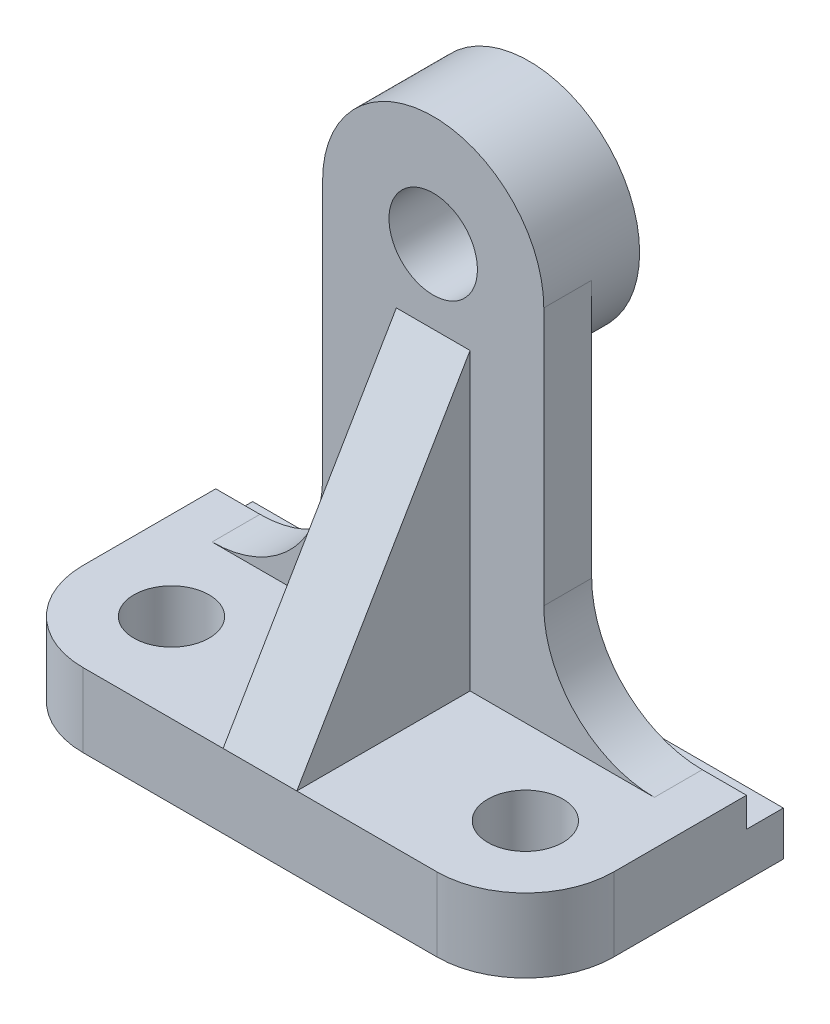
ISO-10303-21;
HEADER;
FILE_DESCRIPTION(('STEP AP214'),'2;1');
FILE_NAME('part.step','',(''),(''),'','','');
FILE_SCHEMA(('AUTOMOTIVE_DESIGN { 1 0 10303 214 1 1 1 1 }'));
ENDSEC;
DATA;
#1=APPLICATION_CONTEXT('core data for automotive mechanical design processes');
#2=APPLICATION_PROTOCOL_DEFINITION('international standard','automotive_design',2000,#1);
#3=PRODUCT_CONTEXT('',#1,'mechanical');
#4=PRODUCT('Part','Part','',(#3));
#5=PRODUCT_RELATED_PRODUCT_CATEGORY('part','',(#4));
#6=PRODUCT_DEFINITION_FORMATION('','',#4);
#7=PRODUCT_DEFINITION_CONTEXT('part definition',#1,'design');
#8=PRODUCT_DEFINITION('design','',#6,#7);
#9=PRODUCT_DEFINITION_SHAPE('','',#8);
#10=(LENGTH_UNIT() NAMED_UNIT(*) SI_UNIT(.MILLI.,.METRE.));
#11=(NAMED_UNIT(*) PLANE_ANGLE_UNIT() SI_UNIT($,.RADIAN.));
#12=(NAMED_UNIT(*) SI_UNIT($,.STERADIAN.) SOLID_ANGLE_UNIT());
#13=UNCERTAINTY_MEASURE_WITH_UNIT(LENGTH_MEASURE(1.E-05),#10,'distance_accuracy_value','');
#14=(GEOMETRIC_REPRESENTATION_CONTEXT(3) GLOBAL_UNCERTAINTY_ASSIGNED_CONTEXT((#13)) GLOBAL_UNIT_ASSIGNED_CONTEXT((#10,
#11,#12)) REPRESENTATION_CONTEXT('',''));
#15=CARTESIAN_POINT('',(0.,0.,0.));
#16=DIRECTION('',(0.,0.,1.));
#17=DIRECTION('',(1.,0.,0.));
#18=AXIS2_PLACEMENT_3D('',#15,#16,#17);
#19=CARTESIAN_POINT('',(0.,10.,0.));
#20=DIRECTION('',(0.,-1.,0.));
#21=DIRECTION('',(0.,0.,-1.));
#22=AXIS2_PLACEMENT_3D('',#19,#20,#21);
#23=PLANE('',#22);
#24=CARTESIAN_POINT('',(24.,10.,5.5));
#25=DIRECTION('',(0.,1.,0.));
#26=DIRECTION('',(0.,0.,1.));
#27=AXIS2_PLACEMENT_3D('',#24,#25,#26);
#28=CIRCLE('',#27,5.1);
#29=CARTESIAN_POINT('',(24.,10.,10.6));
#30=VERTEX_POINT('',#29);
#31=EDGE_CURVE('E237',#30,#30,#28,.T.);
#32=ORIENTED_EDGE('',*,*,#31,.F.);
#33=EDGE_LOOP('',(#32));
#34=FACE_BOUND('',#33,.T.);
#35=DIRECTION('',(0.,0.,-1.));
#36=VECTOR('',#35,1.);
#37=CARTESIAN_POINT('',(5.,10.,17.5));
#38=LINE('',#37,#36);
#39=CARTESIAN_POINT('',(5.,10.,17.5));
#40=VERTEX_POINT('',#39);
#41=CARTESIAN_POINT('',(5.,10.,-6.));
#42=VERTEX_POINT('',#41);
#43=EDGE_CURVE('E171',#40,#42,#38,.T.);
#44=ORIENTED_EDGE('',*,*,#43,.F.);
#45=DIRECTION('',(1.,0.,0.));
#46=VECTOR('',#45,1.);
#47=CARTESIAN_POINT('',(-36.,10.,17.5));
#48=LINE('',#47,#46);
#49=CARTESIAN_POINT('',(24.,10.,17.5));
#50=VERTEX_POINT('',#49);
#51=EDGE_CURVE('E250',#40,#50,#48,.T.);
#52=ORIENTED_EDGE('',*,*,#51,.T.);
#53=CARTESIAN_POINT('',(24.,10.,5.5));
#54=DIRECTION('',(0.,-1.,0.));
#55=DIRECTION('',(0.,0.,-1.));
#56=AXIS2_PLACEMENT_3D('',#53,#54,#55);
#57=CIRCLE('',#56,12.);
#58=CARTESIAN_POINT('',(36.,10.,5.5));
#59=VERTEX_POINT('',#58);
#60=EDGE_CURVE('E276',#50,#59,#57,.F.);
#61=ORIENTED_EDGE('',*,*,#60,.T.);
#62=DIRECTION('',(0.,0.,-1.));
#63=VECTOR('',#62,1.);
#64=CARTESIAN_POINT('',(36.,10.,17.5));
#65=LINE('',#64,#63);
#66=CARTESIAN_POINT('',(36.,10.,-12.5));
#67=VERTEX_POINT('',#66);
#68=EDGE_CURVE('E242',#59,#67,#65,.T.);
#69=ORIENTED_EDGE('',*,*,#68,.T.);
#70=DIRECTION('',(-1.,0.,0.));
#71=VECTOR('',#70,1.);
#72=CARTESIAN_POINT('',(39.,10.,-12.5));
#73=LINE('',#72,#71);
#74=CARTESIAN_POINT('',(30.,10.,-12.5));
#75=VERTEX_POINT('',#74);
#76=EDGE_CURVE('E225',#67,#75,#73,.T.);
#77=ORIENTED_EDGE('',*,*,#76,.T.);
#78=DIRECTION('',(0.,0.,-1.));
#79=VECTOR('',#78,1.);
#80=CARTESIAN_POINT('',(30.,10.,-6.));
#81=LINE('',#80,#79);
#82=CARTESIAN_POINT('',(30.,10.,-6.));
#83=VERTEX_POINT('',#82);
#84=EDGE_CURVE('E295',#75,#83,#81,.F.);
#85=ORIENTED_EDGE('',*,*,#84,.T.);
#86=DIRECTION('',(1.,0.,0.));
#87=VECTOR('',#86,1.);
#88=CARTESIAN_POINT('',(0.,10.,-6.));
#89=LINE('',#88,#87);
#90=EDGE_CURVE('E200',#42,#83,#89,.T.);
#91=ORIENTED_EDGE('',*,*,#90,.F.);
#92=EDGE_LOOP('',(#44,#52,#61,#69,#77,#85,#91));
#93=FACE_BOUND('',#92,.T.);
#94=ADVANCED_FACE('F41',(#34,#93),#23,.F.);
#95=CARTESIAN_POINT('',(-24.,10.,5.5));
#96=DIRECTION('',(0.,1.,0.));
#97=DIRECTION('',(0.,0.,-1.));
#98=AXIS2_PLACEMENT_3D('',#95,#96,#97);
#99=CIRCLE('',#98,5.1);
#100=CARTESIAN_POINT('',(-24.,10.,0.4));
#101=VERTEX_POINT('',#100);
#102=EDGE_CURVE('E230',#101,#101,#99,.T.);
#103=ORIENTED_EDGE('',*,*,#102,.F.);
#104=EDGE_LOOP('',(#103));
#105=FACE_BOUND('',#104,.T.);
#106=CARTESIAN_POINT('',(-24.,10.,17.5));
#107=VERTEX_POINT('',#106);
#108=CARTESIAN_POINT('',(-5.,10.,17.5));
#109=VERTEX_POINT('',#108);
#110=EDGE_CURVE('E248',#107,#109,#48,.T.);
#111=ORIENTED_EDGE('',*,*,#110,.T.);
#112=DIRECTION('',(0.,0.,-1.));
#113=VECTOR('',#112,1.);
#114=CARTESIAN_POINT('',(-5.,10.,17.5));
#115=LINE('',#114,#113);
#116=CARTESIAN_POINT('',(-5.,10.,-6.));
#117=VERTEX_POINT('',#116);
#118=EDGE_CURVE('E179',#109,#117,#115,.T.);
#119=ORIENTED_EDGE('',*,*,#118,.T.);
#120=CARTESIAN_POINT('',(-30.,10.,-6.));
#121=VERTEX_POINT('',#120);
#122=EDGE_CURVE('E198',#121,#117,#89,.T.);
#123=ORIENTED_EDGE('',*,*,#122,.F.);
#124=DIRECTION('',(0.,0.,-1.));
#125=VECTOR('',#124,1.);
#126=CARTESIAN_POINT('',(-30.,10.,0.));
#127=LINE('',#126,#125);
#128=CARTESIAN_POINT('',(-30.,10.,-12.5));
#129=VERTEX_POINT('',#128);
#130=EDGE_CURVE('E293',#121,#129,#127,.T.);
#131=ORIENTED_EDGE('',*,*,#130,.T.);
#132=CARTESIAN_POINT('',(-36.,10.,-12.5));
#133=VERTEX_POINT('',#132);
#134=EDGE_CURVE('E226',#129,#133,#73,.T.);
#135=ORIENTED_EDGE('',*,*,#134,.T.);
#136=DIRECTION('',(0.,0.,1.));
#137=VECTOR('',#136,1.);
#138=CARTESIAN_POINT('',(-36.,10.,17.5));
#139=LINE('',#138,#137);
#140=CARTESIAN_POINT('',(-36.,10.,5.5));
#141=VERTEX_POINT('',#140);
#142=EDGE_CURVE('E245',#133,#141,#139,.T.);
#143=ORIENTED_EDGE('',*,*,#142,.T.);
#144=CARTESIAN_POINT('',(-24.,10.,5.5));
#145=DIRECTION('',(0.,-1.,0.));
#146=DIRECTION('',(0.,0.,-1.));
#147=AXIS2_PLACEMENT_3D('',#144,#145,#146);
#148=CIRCLE('',#147,12.);
#149=EDGE_CURVE('E281',#141,#107,#148,.F.);
#150=ORIENTED_EDGE('',*,*,#149,.T.);
#151=EDGE_LOOP('',(#111,#119,#123,#131,#135,#143,#150));
#152=FACE_BOUND('',#151,.T.);
#153=ADVANCED_FACE('F336',(#105,#152),#23,.F.);
#154=CARTESIAN_POINT('',(-36.,10.,-17.5));
#155=DIRECTION('',(0.,0.,1.));
#156=DIRECTION('',(1.,0.,0.));
#157=AXIS2_PLACEMENT_3D('',#154,#155,#156);
#158=PLANE('',#157);
#159=DIRECTION('',(-1.,0.,0.));
#160=VECTOR('',#159,1.);
#161=CARTESIAN_POINT('',(39.,6.,-17.5));
#162=LINE('',#161,#160);
#163=CARTESIAN_POINT('',(36.,6.,-17.5));
#164=VERTEX_POINT('',#163);
#165=CARTESIAN_POINT('',(-36.,6.,-17.5));
#166=VERTEX_POINT('',#165);
#167=EDGE_CURVE('E222',#164,#166,#162,.T.);
#168=ORIENTED_EDGE('',*,*,#167,.F.);
#169=DIRECTION('',(0.,-1.,0.));
#170=VECTOR('',#169,1.);
#171=CARTESIAN_POINT('',(36.,10.,-17.5));
#172=LINE('',#171,#170);
#173=CARTESIAN_POINT('',(36.,0.,-17.5));
#174=VERTEX_POINT('',#173);
#175=EDGE_CURVE('E262',#164,#174,#172,.T.);
#176=ORIENTED_EDGE('',*,*,#175,.T.);
#177=DIRECTION('',(-1.,0.,0.));
#178=VECTOR('',#177,1.);
#179=CARTESIAN_POINT('',(-36.,0.,-17.5));
#180=LINE('',#179,#178);
#181=CARTESIAN_POINT('',(-36.,0.,-17.5));
#182=VERTEX_POINT('',#181);
#183=EDGE_CURVE('E254',#174,#182,#180,.T.);
#184=ORIENTED_EDGE('',*,*,#183,.T.);
#185=DIRECTION('',(0.,-1.,0.));
#186=VECTOR('',#185,1.);
#187=CARTESIAN_POINT('',(-36.,10.,-17.5));
#188=LINE('',#187,#186);
#189=EDGE_CURVE('E252',#166,#182,#188,.T.);
#190=ORIENTED_EDGE('',*,*,#189,.F.);
#191=EDGE_LOOP('',(#168,#176,#184,#190));
#192=FACE_BOUND('',#191,.T.);
#193=ADVANCED_FACE('F362',(#192),#158,.F.);
#194=CARTESIAN_POINT('',(-36.,10.,17.5));
#195=DIRECTION('',(1.,0.,0.));
#196=DIRECTION('',(0.,0.,-1.));
#197=AXIS2_PLACEMENT_3D('',#194,#195,#196);
#198=PLANE('',#197);
#199=DIRECTION('',(0.,0.,1.));
#200=VECTOR('',#199,1.);
#201=CARTESIAN_POINT('',(-36.,6.,-12.5));
#202=LINE('',#201,#200);
#203=CARTESIAN_POINT('',(-36.,6.,-12.5));
#204=VERTEX_POINT('',#203);
#205=EDGE_CURVE('E213',#166,#204,#202,.T.);
#206=ORIENTED_EDGE('',*,*,#205,.F.);
#207=ORIENTED_EDGE('',*,*,#189,.T.);
#208=DIRECTION('',(0.,0.,1.));
#209=VECTOR('',#208,1.);
#210=CARTESIAN_POINT('',(-36.,0.,17.5));
#211=LINE('',#210,#209);
#212=CARTESIAN_POINT('',(-36.,0.,5.5));
#213=VERTEX_POINT('',#212);
#214=EDGE_CURVE('E256',#182,#213,#211,.T.);
#215=ORIENTED_EDGE('',*,*,#214,.T.);
#216=DIRECTION('',(0.,-1.,0.));
#217=VECTOR('',#216,1.);
#218=CARTESIAN_POINT('',(-36.,10.,5.5));
#219=LINE('',#218,#217);
#220=EDGE_CURVE('E277',#213,#141,#219,.F.);
#221=ORIENTED_EDGE('',*,*,#220,.T.);
#222=ORIENTED_EDGE('',*,*,#142,.F.);
#223=DIRECTION('',(0.,1.,0.));
#224=VECTOR('',#223,1.);
#225=CARTESIAN_POINT('',(-36.,10.,-12.5));
#226=LINE('',#225,#224);
#227=EDGE_CURVE('E217',#204,#133,#226,.T.);
#228=ORIENTED_EDGE('',*,*,#227,.F.);
#229=EDGE_LOOP('',(#206,#207,#215,#221,#222,#228));
#230=FACE_BOUND('',#229,.T.);
#231=ADVANCED_FACE('F341',(#230),#198,.F.);
#232=CARTESIAN_POINT('',(0.,0.,0.));
#233=DIRECTION('',(0.,-1.,0.));
#234=DIRECTION('',(0.,0.,-1.));
#235=AXIS2_PLACEMENT_3D('',#232,#233,#234);
#236=PLANE('',#235);
#237=CARTESIAN_POINT('',(24.,0.,5.5));
#238=DIRECTION('',(0.,1.,0.));
#239=DIRECTION('',(0.,0.,1.));
#240=AXIS2_PLACEMENT_3D('',#237,#238,#239);
#241=CIRCLE('',#240,5.1);
#242=CARTESIAN_POINT('',(24.,0.,10.6));
#243=VERTEX_POINT('',#242);
#244=EDGE_CURVE('E235',#243,#243,#241,.T.);
#245=ORIENTED_EDGE('',*,*,#244,.T.);
#246=EDGE_LOOP('',(#245));
#247=FACE_BOUND('',#246,.T.);
#248=DIRECTION('',(1.,0.,0.));
#249=VECTOR('',#248,1.);
#250=CARTESIAN_POINT('',(-36.,0.,17.5));
#251=LINE('',#250,#249);
#252=CARTESIAN_POINT('',(-24.,0.,17.5));
#253=VERTEX_POINT('',#252);
#254=CARTESIAN_POINT('',(24.,0.,17.5));
#255=VERTEX_POINT('',#254);
#256=EDGE_CURVE('E249',#253,#255,#251,.T.);
#257=ORIENTED_EDGE('',*,*,#256,.F.);
#258=CARTESIAN_POINT('',(-24.,0.,5.5));
#259=DIRECTION('',(0.,-1.,0.));
#260=DIRECTION('',(0.,0.,-1.));
#261=AXIS2_PLACEMENT_3D('',#258,#259,#260);
#262=CIRCLE('',#261,12.);
#263=EDGE_CURVE('E273',#253,#213,#262,.T.);
#264=ORIENTED_EDGE('',*,*,#263,.T.);
#265=ORIENTED_EDGE('',*,*,#214,.F.);
#266=ORIENTED_EDGE('',*,*,#183,.F.);
#267=DIRECTION('',(0.,0.,-1.));
#268=VECTOR('',#267,1.);
#269=CARTESIAN_POINT('',(36.,0.,17.5));
#270=LINE('',#269,#268);
#271=CARTESIAN_POINT('',(36.,0.,5.5));
#272=VERTEX_POINT('',#271);
#273=EDGE_CURVE('E239',#272,#174,#270,.T.);
#274=ORIENTED_EDGE('',*,*,#273,.F.);
#275=CARTESIAN_POINT('',(24.,0.,5.5));
#276=DIRECTION('',(0.,-1.,0.));
#277=DIRECTION('',(0.,0.,-1.));
#278=AXIS2_PLACEMENT_3D('',#275,#276,#277);
#279=CIRCLE('',#278,12.);
#280=EDGE_CURVE('E275',#272,#255,#279,.T.);
#281=ORIENTED_EDGE('',*,*,#280,.T.);
#282=EDGE_LOOP('',(#257,#264,#265,#266,#274,#281));
#283=FACE_BOUND('',#282,.T.);
#284=CARTESIAN_POINT('',(-24.,0.,5.5));
#285=DIRECTION('',(0.,1.,0.));
#286=DIRECTION('',(0.,0.,-1.));
#287=AXIS2_PLACEMENT_3D('',#284,#285,#286);
#288=CIRCLE('',#287,5.1);
#289=CARTESIAN_POINT('',(-24.,0.,0.4));
#290=VERTEX_POINT('',#289);
#291=EDGE_CURVE('E223',#290,#290,#288,.T.);
#292=ORIENTED_EDGE('',*,*,#291,.T.);
#293=EDGE_LOOP('',(#292));
#294=FACE_BOUND('',#293,.T.);
#295=ADVANCED_FACE('F359',(#247,#283,#294),#236,.T.);
#296=CARTESIAN_POINT('',(36.,10.,17.5));
#297=DIRECTION('',(-1.,0.,0.));
#298=DIRECTION('',(0.,0.,1.));
#299=AXIS2_PLACEMENT_3D('',#296,#297,#298);
#300=PLANE('',#299);
#301=DIRECTION('',(0.,0.,1.));
#302=VECTOR('',#301,1.);
#303=CARTESIAN_POINT('',(36.,6.,17.5));
#304=LINE('',#303,#302);
#305=CARTESIAN_POINT('',(36.,6.,-12.5));
#306=VERTEX_POINT('',#305);
#307=EDGE_CURVE('E289',#164,#306,#304,.T.);
#308=ORIENTED_EDGE('',*,*,#307,.T.);
#309=DIRECTION('',(0.,1.,0.));
#310=VECTOR('',#309,1.);
#311=CARTESIAN_POINT('',(36.,10.,-12.5));
#312=LINE('',#311,#310);
#313=EDGE_CURVE('E288',#306,#67,#312,.T.);
#314=ORIENTED_EDGE('',*,*,#313,.T.);
#315=ORIENTED_EDGE('',*,*,#68,.F.);
#316=DIRECTION('',(0.,-1.,0.));
#317=VECTOR('',#316,1.);
#318=CARTESIAN_POINT('',(36.,10.,5.5));
#319=LINE('',#318,#317);
#320=EDGE_CURVE('E284',#59,#272,#319,.T.);
#321=ORIENTED_EDGE('',*,*,#320,.T.);
#322=ORIENTED_EDGE('',*,*,#273,.T.);
#323=ORIENTED_EDGE('',*,*,#175,.F.);
#324=EDGE_LOOP('',(#308,#314,#315,#321,#322,#323));
#325=FACE_BOUND('',#324,.T.);
#326=ADVANCED_FACE('F368',(#325),#300,.F.);
#327=CARTESIAN_POINT('',(-36.,10.,17.5));
#328=DIRECTION('',(0.,0.,-1.));
#329=DIRECTION('',(-1.,0.,0.));
#330=AXIS2_PLACEMENT_3D('',#327,#328,#329);
#331=PLANE('',#330);
#332=ORIENTED_EDGE('',*,*,#110,.F.);
#333=DIRECTION('',(0.,-1.,0.));
#334=VECTOR('',#333,1.);
#335=CARTESIAN_POINT('',(-24.,10.,17.5));
#336=LINE('',#335,#334);
#337=EDGE_CURVE('E267',#107,#253,#336,.T.);
#338=ORIENTED_EDGE('',*,*,#337,.T.);
#339=ORIENTED_EDGE('',*,*,#256,.T.);
#340=DIRECTION('',(0.,-1.,0.));
#341=VECTOR('',#340,1.);
#342=CARTESIAN_POINT('',(24.,10.,17.5));
#343=LINE('',#342,#341);
#344=EDGE_CURVE('E266',#255,#50,#343,.F.);
#345=ORIENTED_EDGE('',*,*,#344,.T.);
#346=ORIENTED_EDGE('',*,*,#51,.F.);
#347=DIRECTION('',(-1.,0.,0.));
#348=VECTOR('',#347,1.);
#349=CARTESIAN_POINT('',(5.,10.,17.5));
#350=LINE('',#349,#348);
#351=EDGE_CURVE('E162',#40,#109,#350,.T.);
#352=ORIENTED_EDGE('',*,*,#351,.T.);
#353=EDGE_LOOP('',(#332,#338,#339,#345,#346,#352));
#354=FACE_BOUND('',#353,.T.);
#355=ADVANCED_FACE('F348',(#354),#331,.F.);
#356=CARTESIAN_POINT('',(24.,10.,5.5));
#357=DIRECTION('',(0.,-1.,0.));
#358=DIRECTION('',(0.,0.,-1.));
#359=AXIS2_PLACEMENT_3D('',#356,#357,#358);
#360=CYLINDRICAL_SURFACE('',#359,5.1);
#361=ORIENTED_EDGE('',*,*,#31,.T.);
#362=EDGE_LOOP('',(#361));
#363=FACE_BOUND('',#362,.T.);
#364=ORIENTED_EDGE('',*,*,#244,.F.);
#365=EDGE_LOOP('',(#364));
#366=FACE_BOUND('',#365,.T.);
#367=ADVANCED_FACE('F393',(#363,#366),#360,.F.);
#368=CARTESIAN_POINT('',(-24.,10.,5.5));
#369=DIRECTION('',(0.,-1.,0.));
#370=DIRECTION('',(0.,0.,-1.));
#371=AXIS2_PLACEMENT_3D('',#368,#369,#370);
#372=CYLINDRICAL_SURFACE('',#371,5.1);
#373=ORIENTED_EDGE('',*,*,#102,.T.);
#374=EDGE_LOOP('',(#373));
#375=FACE_BOUND('',#374,.T.);
#376=ORIENTED_EDGE('',*,*,#291,.F.);
#377=EDGE_LOOP('',(#376));
#378=FACE_BOUND('',#377,.T.);
#379=ADVANCED_FACE('F381',(#375,#378),#372,.F.);
#380=CARTESIAN_POINT('',(-24.,10.,5.5));
#381=DIRECTION('',(0.,-1.,0.));
#382=DIRECTION('',(0.,0.,-1.));
#383=AXIS2_PLACEMENT_3D('',#380,#381,#382);
#384=CYLINDRICAL_SURFACE('',#383,12.);
#385=ORIENTED_EDGE('',*,*,#149,.F.);
#386=ORIENTED_EDGE('',*,*,#220,.F.);
#387=ORIENTED_EDGE('',*,*,#263,.F.);
#388=ORIENTED_EDGE('',*,*,#337,.F.);
#389=EDGE_LOOP('',(#385,#386,#387,#388));
#390=FACE_BOUND('',#389,.T.);
#391=ADVANCED_FACE('F354',(#390),#384,.T.);
#392=CARTESIAN_POINT('',(24.,10.,5.5));
#393=DIRECTION('',(0.,-1.,0.));
#394=DIRECTION('',(0.,0.,-1.));
#395=AXIS2_PLACEMENT_3D('',#392,#393,#394);
#396=CYLINDRICAL_SURFACE('',#395,12.);
#397=ORIENTED_EDGE('',*,*,#60,.F.);
#398=ORIENTED_EDGE('',*,*,#344,.F.);
#399=ORIENTED_EDGE('',*,*,#280,.F.);
#400=ORIENTED_EDGE('',*,*,#320,.F.);
#401=EDGE_LOOP('',(#397,#398,#399,#400));
#402=FACE_BOUND('',#401,.T.);
#403=ADVANCED_FACE('F367',(#402),#396,.T.);
#404=CARTESIAN_POINT('',(39.,10.,-12.5));
#405=DIRECTION('',(0.,0.,1.));
#406=DIRECTION('',(1.,0.,0.));
#407=AXIS2_PLACEMENT_3D('',#404,#405,#406);
#408=PLANE('',#407);
#409=DIRECTION('',(-1.,0.,0.));
#410=VECTOR('',#409,1.);
#411=CARTESIAN_POINT('',(39.,6.,-12.5));
#412=LINE('',#411,#410);
#413=EDGE_CURVE('E227',#306,#204,#412,.T.);
#414=ORIENTED_EDGE('',*,*,#413,.T.);
#415=ORIENTED_EDGE('',*,*,#227,.T.);
#416=ORIENTED_EDGE('',*,*,#134,.F.);
#417=CARTESIAN_POINT('',(-30.,25.,-12.5));
#418=DIRECTION('',(0.,0.,1.));
#419=DIRECTION('',(1.,0.,0.));
#420=AXIS2_PLACEMENT_3D('',#417,#418,#419);
#421=CIRCLE('',#420,15.);
#422=CARTESIAN_POINT('',(-15.,25.,-12.5));
#423=VERTEX_POINT('',#422);
#424=EDGE_CURVE('E305',#129,#423,#421,.T.);
#425=ORIENTED_EDGE('',*,*,#424,.T.);
#426=DIRECTION('',(0.,1.,0.));
#427=VECTOR('',#426,1.);
#428=CARTESIAN_POINT('',(-15.,0.,-12.5));
#429=LINE('',#428,#427);
#430=CARTESIAN_POINT('',(-15.,60.,-12.5));
#431=VERTEX_POINT('',#430);
#432=EDGE_CURVE('E194',#423,#431,#429,.T.);
#433=ORIENTED_EDGE('',*,*,#432,.T.);
#434=CARTESIAN_POINT('',(0.,60.,-12.5));
#435=DIRECTION('',(0.,0.,-1.));
#436=DIRECTION('',(-1.,0.,0.));
#437=AXIS2_PLACEMENT_3D('',#434,#435,#436);
#438=CIRCLE('',#437,15.);
#439=CARTESIAN_POINT('',(15.,60.,-12.5));
#440=VERTEX_POINT('',#439);
#441=EDGE_CURVE('E202',#440,#431,#438,.T.);
#442=ORIENTED_EDGE('',*,*,#441,.F.);
#443=DIRECTION('',(0.,1.,0.));
#444=VECTOR('',#443,1.);
#445=CARTESIAN_POINT('',(15.,0.,-12.5));
#446=LINE('',#445,#444);
#447=CARTESIAN_POINT('',(15.,25.,-12.5));
#448=VERTEX_POINT('',#447);
#449=EDGE_CURVE('E208',#448,#440,#446,.T.);
#450=ORIENTED_EDGE('',*,*,#449,.F.);
#451=CARTESIAN_POINT('',(30.,25.,-12.5));
#452=DIRECTION('',(0.,0.,1.));
#453=DIRECTION('',(1.,0.,0.));
#454=AXIS2_PLACEMENT_3D('',#451,#452,#453);
#455=CIRCLE('',#454,15.);
#456=EDGE_CURVE('E47',#448,#75,#455,.T.);
#457=ORIENTED_EDGE('',*,*,#456,.T.);
#458=ORIENTED_EDGE('',*,*,#76,.F.);
#459=ORIENTED_EDGE('',*,*,#313,.F.);
#460=EDGE_LOOP('',(#414,#415,#416,#425,#433,#442,#450,#457,#458,#459));
#461=FACE_BOUND('',#460,.T.);
#462=ADVANCED_FACE('F310',(#461),#408,.F.);
#463=CARTESIAN_POINT('',(39.,6.,-12.5));
#464=DIRECTION('',(0.,-1.,0.));
#465=DIRECTION('',(0.,0.,-1.));
#466=AXIS2_PLACEMENT_3D('',#463,#464,#465);
#467=PLANE('',#466);
#468=ORIENTED_EDGE('',*,*,#167,.T.);
#469=ORIENTED_EDGE('',*,*,#205,.T.);
#470=ORIENTED_EDGE('',*,*,#413,.F.);
#471=ORIENTED_EDGE('',*,*,#307,.F.);
#472=EDGE_LOOP('',(#468,#469,#470,#471));
#473=FACE_BOUND('',#472,.T.);
#474=ADVANCED_FACE('F377',(#473),#467,.F.);
#475=CARTESIAN_POINT('',(15.,0.,-6.));
#476=DIRECTION('',(-1.,0.,0.));
#477=DIRECTION('',(0.,0.,1.));
#478=AXIS2_PLACEMENT_3D('',#475,#476,#477);
#479=PLANE('',#478);
#480=DIRECTION('',(0.,1.,0.));
#481=VECTOR('',#480,1.);
#482=CARTESIAN_POINT('',(15.,0.,-6.));
#483=LINE('',#482,#481);
#484=CARTESIAN_POINT('',(15.,25.,-6.));
#485=VERTEX_POINT('',#484);
#486=CARTESIAN_POINT('',(15.,60.,-6.));
#487=VERTEX_POINT('',#486);
#488=EDGE_CURVE('E203',#485,#487,#483,.T.);
#489=ORIENTED_EDGE('',*,*,#488,.F.);
#490=DIRECTION('',(0.,0.,-1.));
#491=VECTOR('',#490,1.);
#492=CARTESIAN_POINT('',(15.,25.,-12.5));
#493=LINE('',#492,#491);
#494=EDGE_CURVE('E300',#485,#448,#493,.T.);
#495=ORIENTED_EDGE('',*,*,#494,.T.);
#496=ORIENTED_EDGE('',*,*,#449,.T.);
#497=DIRECTION('',(0.,0.,-1.));
#498=VECTOR('',#497,1.);
#499=CARTESIAN_POINT('',(15.,60.,-6.));
#500=LINE('',#499,#498);
#501=EDGE_CURVE('E209',#487,#440,#500,.T.);
#502=ORIENTED_EDGE('',*,*,#501,.F.);
#503=EDGE_LOOP('',(#489,#495,#496,#502));
#504=FACE_BOUND('',#503,.T.);
#505=ADVANCED_FACE('F325',(#504),#479,.F.);
#506=CARTESIAN_POINT('',(-15.,0.,-6.));
#507=DIRECTION('',(-1.,0.,0.));
#508=DIRECTION('',(0.,0.,1.));
#509=AXIS2_PLACEMENT_3D('',#506,#507,#508);
#510=PLANE('',#509);
#511=ORIENTED_EDGE('',*,*,#432,.F.);
#512=DIRECTION('',(0.,0.,-1.));
#513=VECTOR('',#512,1.);
#514=CARTESIAN_POINT('',(-15.,25.,-6.));
#515=LINE('',#514,#513);
#516=CARTESIAN_POINT('',(-15.,25.,-6.));
#517=VERTEX_POINT('',#516);
#518=EDGE_CURVE('E299',#423,#517,#515,.F.);
#519=ORIENTED_EDGE('',*,*,#518,.T.);
#520=DIRECTION('',(0.,1.,0.));
#521=VECTOR('',#520,1.);
#522=CARTESIAN_POINT('',(-15.,0.,-6.));
#523=LINE('',#522,#521);
#524=CARTESIAN_POINT('',(-15.,60.,-6.));
#525=VERTEX_POINT('',#524);
#526=EDGE_CURVE('E196',#517,#525,#523,.T.);
#527=ORIENTED_EDGE('',*,*,#526,.T.);
#528=DIRECTION('',(0.,0.,-1.));
#529=VECTOR('',#528,1.);
#530=CARTESIAN_POINT('',(-15.,60.,-6.));
#531=LINE('',#530,#529);
#532=EDGE_CURVE('E201',#525,#431,#531,.T.);
#533=ORIENTED_EDGE('',*,*,#532,.T.);
#534=EDGE_LOOP('',(#511,#519,#527,#533));
#535=FACE_BOUND('',#534,.T.);
#536=ADVANCED_FACE('F460',(#535),#510,.T.);
#537=CARTESIAN_POINT('',(0.,0.,-6.));
#538=DIRECTION('',(0.,0.,-1.));
#539=DIRECTION('',(-1.,0.,0.));
#540=AXIS2_PLACEMENT_3D('',#537,#538,#539);
#541=PLANE('',#540);
#542=ORIENTED_EDGE('',*,*,#122,.T.);
#543=DIRECTION('',(0.,1.,0.));
#544=VECTOR('',#543,1.);
#545=CARTESIAN_POINT('',(-5.,10.,-6.));
#546=LINE('',#545,#544);
#547=CARTESIAN_POINT('',(-5.,50.,-6.));
#548=VERTEX_POINT('',#547);
#549=EDGE_CURVE('E57',#117,#548,#546,.T.);
#550=ORIENTED_EDGE('',*,*,#549,.T.);
#551=DIRECTION('',(-1.,0.,0.));
#552=VECTOR('',#551,1.);
#553=CARTESIAN_POINT('',(5.,50.,-6.));
#554=LINE('',#553,#552);
#555=CARTESIAN_POINT('',(5.,50.,-6.));
#556=VERTEX_POINT('',#555);
#557=EDGE_CURVE('E156',#556,#548,#554,.T.);
#558=ORIENTED_EDGE('',*,*,#557,.F.);
#559=DIRECTION('',(0.,1.,0.));
#560=VECTOR('',#559,1.);
#561=CARTESIAN_POINT('',(5.,10.,-6.));
#562=LINE('',#561,#560);
#563=EDGE_CURVE('E62',#42,#556,#562,.T.);
#564=ORIENTED_EDGE('',*,*,#563,.F.);
#565=ORIENTED_EDGE('',*,*,#90,.T.);
#566=CARTESIAN_POINT('',(30.,25.,-6.));
#567=DIRECTION('',(0.,0.,-1.));
#568=DIRECTION('',(-1.,0.,0.));
#569=AXIS2_PLACEMENT_3D('',#566,#567,#568);
#570=CIRCLE('',#569,15.);
#571=EDGE_CURVE('E11',#83,#485,#570,.T.);
#572=ORIENTED_EDGE('',*,*,#571,.T.);
#573=ORIENTED_EDGE('',*,*,#488,.T.);
#574=CARTESIAN_POINT('',(0.,60.,-6.));
#575=DIRECTION('',(0.,0.,-1.));
#576=DIRECTION('',(-1.,0.,0.));
#577=AXIS2_PLACEMENT_3D('',#574,#575,#576);
#578=CIRCLE('',#577,15.);
#579=EDGE_CURVE('E189',#525,#487,#578,.T.);
#580=ORIENTED_EDGE('',*,*,#579,.F.);
#581=ORIENTED_EDGE('',*,*,#526,.F.);
#582=CARTESIAN_POINT('',(-30.,25.,-6.));
#583=DIRECTION('',(0.,0.,-1.));
#584=DIRECTION('',(-1.,0.,0.));
#585=AXIS2_PLACEMENT_3D('',#582,#583,#584);
#586=CIRCLE('',#585,15.);
#587=EDGE_CURVE('E302',#517,#121,#586,.T.);
#588=ORIENTED_EDGE('',*,*,#587,.T.);
#589=EDGE_LOOP('',(#542,#550,#558,#564,#565,#572,#573,#580,#581,#588));
#590=FACE_BOUND('',#589,.T.);
#591=CARTESIAN_POINT('',(0.,60.,-6.));
#592=DIRECTION('',(0.,0.,-1.));
#593=DIRECTION('',(-1.,0.,0.));
#594=AXIS2_PLACEMENT_3D('',#591,#592,#593);
#595=CIRCLE('',#594,6.);
#596=CARTESIAN_POINT('',(6.,60.,-6.));
#597=VERTEX_POINT('',#596);
#598=EDGE_CURVE('E181',#597,#597,#595,.T.);
#599=ORIENTED_EDGE('',*,*,#598,.T.);
#600=EDGE_LOOP('',(#599));
#601=FACE_BOUND('',#600,.T.);
#602=ADVANCED_FACE('F160',(#590,#601),#541,.F.);
#603=CARTESIAN_POINT('',(0.,60.,-19.));
#604=DIRECTION('',(0.,0.,1.));
#605=DIRECTION('',(1.,0.,0.));
#606=AXIS2_PLACEMENT_3D('',#603,#604,#605);
#607=CYLINDRICAL_SURFACE('',#606,6.);
#608=CARTESIAN_POINT('',(0.,60.,-19.));
#609=DIRECTION('',(0.,0.,-1.));
#610=DIRECTION('',(-1.,0.,0.));
#611=AXIS2_PLACEMENT_3D('',#608,#609,#610);
#612=CIRCLE('',#611,6.);
#613=CARTESIAN_POINT('',(6.,60.,-19.));
#614=VERTEX_POINT('',#613);
#615=EDGE_CURVE('E184',#614,#614,#612,.T.);
#616=CARTESIAN_POINT('',(6.,60.,-19.));
#617=CARTESIAN_POINT('',(6.,60.,-18.8645833333333));
#618=CARTESIAN_POINT('',(6.,60.,-18.7291666666667));
#619=CARTESIAN_POINT('',(6.,60.,-18.4583333333333));
#620=CARTESIAN_POINT('',(6.,60.,-18.3229166666667));
#621=CARTESIAN_POINT('',(6.,60.,-18.0520833333333));
#622=CARTESIAN_POINT('',(6.,60.,-17.9166666666667));
#623=CARTESIAN_POINT('',(6.,60.,-17.6458333333333));
#624=CARTESIAN_POINT('',(6.,60.,-17.5104166666667));
#625=CARTESIAN_POINT('',(6.,60.,-17.2395833333333));
#626=CARTESIAN_POINT('',(6.,60.,-17.1041666666667));
#627=CARTESIAN_POINT('',(6.,60.,-16.8333333333333));
#628=CARTESIAN_POINT('',(6.,60.,-16.6979166666667));
#629=CARTESIAN_POINT('',(6.,60.,-16.4270833333333));
#630=CARTESIAN_POINT('',(6.,60.,-16.2916666666667));
#631=CARTESIAN_POINT('',(6.,60.,-16.0208333333333));
#632=CARTESIAN_POINT('',(6.,60.,-15.8854166666667));
#633=CARTESIAN_POINT('',(6.,60.,-15.6145833333333));
#634=CARTESIAN_POINT('',(6.,60.,-15.4791666666667));
#635=CARTESIAN_POINT('',(6.,60.,-15.2083333333333));
#636=CARTESIAN_POINT('',(6.,60.,-15.0729166666667));
#637=CARTESIAN_POINT('',(6.,60.,-14.8020833333333));
#638=CARTESIAN_POINT('',(6.,60.,-14.6666666666667));
#639=CARTESIAN_POINT('',(6.,60.,-14.3958333333333));
#640=CARTESIAN_POINT('',(6.,60.,-14.2604166666667));
#641=CARTESIAN_POINT('',(6.,60.,-13.9895833333333));
#642=CARTESIAN_POINT('',(6.,60.,-13.8541666666667));
#643=CARTESIAN_POINT('',(6.,60.,-13.5833333333333));
#644=CARTESIAN_POINT('',(6.,60.,-13.4479166666667));
#645=CARTESIAN_POINT('',(6.,60.,-13.1770833333333));
#646=CARTESIAN_POINT('',(6.,60.,-13.0416666666667));
#647=CARTESIAN_POINT('',(6.,60.,-12.7708333333333));
#648=CARTESIAN_POINT('',(6.,60.,-12.6354166666667));
#649=CARTESIAN_POINT('',(6.,60.,-12.3645833333333));
#650=CARTESIAN_POINT('',(6.,60.,-12.2291666666667));
#651=CARTESIAN_POINT('',(6.,60.,-11.9583333333333));
#652=CARTESIAN_POINT('',(6.,60.,-11.8229166666667));
#653=CARTESIAN_POINT('',(6.,60.,-11.5520833333333));
#654=CARTESIAN_POINT('',(6.,60.,-11.4166666666667));
#655=CARTESIAN_POINT('',(6.,60.,-11.1458333333333));
#656=CARTESIAN_POINT('',(6.,60.,-11.0104166666667));
#657=CARTESIAN_POINT('',(6.,60.,-10.7395833333333));
#658=CARTESIAN_POINT('',(6.,60.,-10.6041666666667));
#659=CARTESIAN_POINT('',(6.,60.,-10.3333333333333));
#660=CARTESIAN_POINT('',(6.,60.,-10.1979166666667));
#661=CARTESIAN_POINT('',(6.,60.,-9.92708333333333));
#662=CARTESIAN_POINT('',(6.,60.,-9.79166666666667));
#663=CARTESIAN_POINT('',(6.,60.,-9.52083333333333));
#664=CARTESIAN_POINT('',(6.,60.,-9.38541666666667));
#665=CARTESIAN_POINT('',(6.,60.,-9.11458333333333));
#666=CARTESIAN_POINT('',(6.,60.,-8.97916666666667));
#667=CARTESIAN_POINT('',(6.,60.,-8.70833333333333));
#668=CARTESIAN_POINT('',(6.,60.,-8.57291666666667));
#669=CARTESIAN_POINT('',(6.,60.,-8.30208333333333));
#670=CARTESIAN_POINT('',(6.,60.,-8.16666666666667));
#671=CARTESIAN_POINT('',(6.,60.,-7.89583333333333));
#672=CARTESIAN_POINT('',(6.,60.,-7.76041666666667));
#673=CARTESIAN_POINT('',(6.,60.,-7.48958333333333));
#674=CARTESIAN_POINT('',(6.,60.,-7.35416666666667));
#675=CARTESIAN_POINT('',(6.,60.,-7.08333333333333));
#676=CARTESIAN_POINT('',(6.,60.,-6.94791666666667));
#677=CARTESIAN_POINT('',(6.,60.,-6.67708333333333));
#678=CARTESIAN_POINT('',(6.,60.,-6.54166666666667));
#679=CARTESIAN_POINT('',(6.,60.,-6.27083333333333));
#680=CARTESIAN_POINT('',(6.,60.,-6.13541666666667));
#681=CARTESIAN_POINT('',(6.,60.,-6.));
#682=B_SPLINE_CURVE_WITH_KNOTS('',3,(#616,#617,#618,#619,#620,#621,#622,#623,#624,#625,#626,
#627,#628,#629,#630,#631,#632,#633,#634,#635,#636,#637,#638,#639,#640,#641,#642,#643,#644,#645,
#646,#647,#648,#649,#650,#651,#652,#653,#654,#655,#656,#657,#658,#659,#660,#661,#662,#663,#664,
#665,#666,#667,#668,#669,#670,#671,#672,#673,#674,#675,#676,#677,#678,#679,#680,#681),
.UNSPECIFIED.,.F.,.F.,(4,2,2,2,2,2,2,2,2,2,2,2,2,2,2,2,2,2,2,2,2,2,2,2,2,2,2,2,2,2,2,2,4),(0.,
0.40625,0.812500000000001,1.21875,1.625,2.03125,2.4375,2.84375,3.25,3.65625,4.0625,4.46875,
4.875,5.28125,5.6875,6.09375,6.5,6.90625,7.3125,7.71875,8.125,8.53125,8.9375,9.34375,9.75,
10.15625,10.5625,10.96875,11.375,11.78125,12.1875,12.59375,13.),.UNSPECIFIED.);
#683=EDGE_CURVE('BSEAM422',#614,#597,#682,.T.);
#684=ORIENTED_EDGE('',*,*,#615,.T.);
#685=ORIENTED_EDGE('',*,*,#598,.F.);
#686=ORIENTED_EDGE('',*,*,#683,.T.);
#687=ORIENTED_EDGE('',*,*,#683,.F.);
#688=EDGE_LOOP('',(#684,#686,#685,#687));
#689=FACE_BOUND('',#688,.T.);
#690=ADVANCED_FACE('F422',(#689),#607,.F.);
#691=CARTESIAN_POINT('',(0.,60.,-19.));
#692=DIRECTION('',(0.,0.,1.));
#693=DIRECTION('',(1.,0.,0.));
#694=AXIS2_PLACEMENT_3D('',#691,#692,#693);
#695=CYLINDRICAL_SURFACE('',#694,15.);
#696=ORIENTED_EDGE('',*,*,#532,.F.);
#697=ORIENTED_EDGE('',*,*,#579,.T.);
#698=ORIENTED_EDGE('',*,*,#501,.T.);
#699=ORIENTED_EDGE('',*,*,#441,.T.);
#700=EDGE_LOOP('',(#696,#697,#698,#699));
#701=FACE_BOUND('',#700,.T.);
#702=CARTESIAN_POINT('',(0.,60.,-19.));
#703=DIRECTION('',(0.,0.,-1.));
#704=DIRECTION('',(-1.,0.,0.));
#705=AXIS2_PLACEMENT_3D('',#702,#703,#704);
#706=CIRCLE('',#705,15.);
#707=CARTESIAN_POINT('',(-15.,60.,-19.));
#708=VERTEX_POINT('',#707);
#709=EDGE_CURVE('E187',#708,#708,#706,.T.);
#710=ORIENTED_EDGE('',*,*,#709,.F.);
#711=EDGE_LOOP('',(#710));
#712=FACE_BOUND('',#711,.T.);
#713=ADVANCED_FACE('F324',(#701,#712),#695,.T.);
#714=CARTESIAN_POINT('',(0.,0.,-19.));
#715=DIRECTION('',(0.,0.,-1.));
#716=DIRECTION('',(-1.,0.,0.));
#717=AXIS2_PLACEMENT_3D('',#714,#715,#716);
#718=PLANE('',#717);
#719=ORIENTED_EDGE('',*,*,#615,.F.);
#720=EDGE_LOOP('',(#719));
#721=FACE_BOUND('',#720,.T.);
#722=ORIENTED_EDGE('',*,*,#709,.T.);
#723=EDGE_LOOP('',(#722));
#724=FACE_BOUND('',#723,.T.);
#725=ADVANCED_FACE('F440',(#721,#724),#718,.T.);
#726=CARTESIAN_POINT('',(-30.,25.,0.));
#727=DIRECTION('',(0.,0.,-1.));
#728=DIRECTION('',(-1.,0.,0.));
#729=AXIS2_PLACEMENT_3D('',#726,#727,#728);
#730=CYLINDRICAL_SURFACE('',#729,15.);
#731=ORIENTED_EDGE('',*,*,#587,.F.);
#732=ORIENTED_EDGE('',*,*,#518,.F.);
#733=ORIENTED_EDGE('',*,*,#424,.F.);
#734=ORIENTED_EDGE('',*,*,#130,.F.);
#735=EDGE_LOOP('',(#731,#732,#733,#734));
#736=FACE_BOUND('',#735,.T.);
#737=ADVANCED_FACE('F334',(#736),#730,.F.);
#738=CARTESIAN_POINT('',(30.,25.,-6.));
#739=DIRECTION('',(0.,0.,1.));
#740=DIRECTION('',(1.,0.,0.));
#741=AXIS2_PLACEMENT_3D('',#738,#739,#740);
#742=CYLINDRICAL_SURFACE('',#741,15.);
#743=ORIENTED_EDGE('',*,*,#571,.F.);
#744=ORIENTED_EDGE('',*,*,#84,.F.);
#745=ORIENTED_EDGE('',*,*,#456,.F.);
#746=ORIENTED_EDGE('',*,*,#494,.F.);
#747=EDGE_LOOP('',(#743,#744,#745,#746));
#748=FACE_BOUND('',#747,.T.);
#749=ADVANCED_FACE('F43',(#748),#742,.F.);
#750=CARTESIAN_POINT('',(5.,50.,-6.));
#751=DIRECTION('',(0.,-0.506549048630866,-0.862211146605729));
#752=DIRECTION('',(0.,0.862211146605729,-0.506549048630866));
#753=AXIS2_PLACEMENT_3D('',#750,#751,#752);
#754=PLANE('',#753);
#755=DIRECTION('',(0.,-0.862211146605729,0.506549048630866));
#756=VECTOR('',#755,1.);
#757=CARTESIAN_POINT('',(-5.,50.,-6.));
#758=LINE('',#757,#756);
#759=EDGE_CURVE('E178',#548,#109,#758,.T.);
#760=ORIENTED_EDGE('',*,*,#759,.T.);
#761=ORIENTED_EDGE('',*,*,#351,.F.);
#762=DIRECTION('',(0.,-0.862211146605729,0.506549048630866));
#763=VECTOR('',#762,1.);
#764=CARTESIAN_POINT('',(5.,50.,-6.));
#765=LINE('',#764,#763);
#766=EDGE_CURVE('E166',#556,#40,#765,.T.);
#767=ORIENTED_EDGE('',*,*,#766,.F.);
#768=ORIENTED_EDGE('',*,*,#557,.T.);
#769=EDGE_LOOP('',(#760,#761,#767,#768));
#770=FACE_BOUND('',#769,.T.);
#771=ADVANCED_FACE('F174',(#770),#754,.F.);
#772=CARTESIAN_POINT('',(5.,0.,0.));
#773=DIRECTION('',(1.,0.,0.));
#774=DIRECTION('',(0.,0.,-1.));
#775=AXIS2_PLACEMENT_3D('',#772,#773,#774);
#776=PLANE('',#775);
#777=ORIENTED_EDGE('',*,*,#766,.T.);
#778=ORIENTED_EDGE('',*,*,#43,.T.);
#779=ORIENTED_EDGE('',*,*,#563,.T.);
#780=EDGE_LOOP('',(#777,#778,#779));
#781=FACE_BOUND('',#780,.T.);
#782=ADVANCED_FACE('F169',(#781),#776,.T.);
#783=CARTESIAN_POINT('',(-5.,0.,0.));
#784=DIRECTION('',(1.,0.,0.));
#785=DIRECTION('',(0.,0.,-1.));
#786=AXIS2_PLACEMENT_3D('',#783,#784,#785);
#787=PLANE('',#786);
#788=ORIENTED_EDGE('',*,*,#759,.F.);
#789=ORIENTED_EDGE('',*,*,#549,.F.);
#790=ORIENTED_EDGE('',*,*,#118,.F.);
#791=EDGE_LOOP('',(#788,#789,#790));
#792=FACE_BOUND('',#791,.T.);
#793=ADVANCED_FACE('F501',(#792),#787,.F.);
#794=CLOSED_SHELL('',(#94,#153,#193,#231,#295,#326,#355,#367,#379,#391,#403,#462,#474,#505,#536,
#602,#690,#713,#725,#737,#749,#771,#782,#793));
#795=MANIFOLD_SOLID_BREP('B2',#794);
#796=ADVANCED_BREP_SHAPE_REPRESENTATION('',(#18,#795),#14);
#797=SHAPE_DEFINITION_REPRESENTATION(#9,#796);
ENDSEC;
END-ISO-10303-21;
